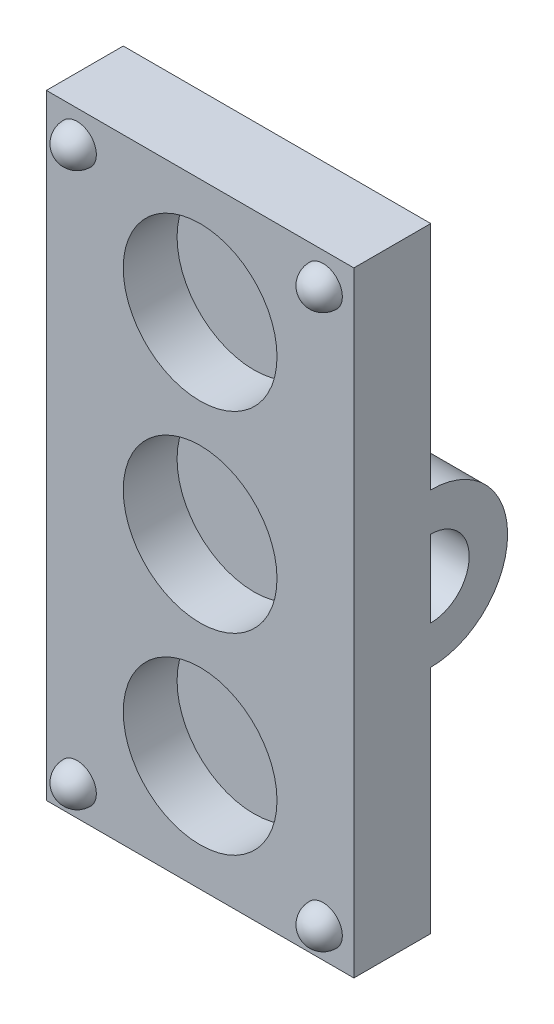
ISO-10303-21;
HEADER;
FILE_DESCRIPTION(('STEP AP214'),'2;1');
FILE_NAME('part.step','',(''),(''),'','','');
FILE_SCHEMA(('AUTOMOTIVE_DESIGN { 1 0 10303 214 1 1 1 1 }'));
ENDSEC;
DATA;
#1=APPLICATION_CONTEXT('core data for automotive mechanical design processes');
#2=APPLICATION_PROTOCOL_DEFINITION('international standard','automotive_design',2000,#1);
#3=PRODUCT_CONTEXT('',#1,'mechanical');
#4=PRODUCT('Part','Part','',(#3));
#5=PRODUCT_RELATED_PRODUCT_CATEGORY('part','',(#4));
#6=PRODUCT_DEFINITION_FORMATION('','',#4);
#7=PRODUCT_DEFINITION_CONTEXT('part definition',#1,'design');
#8=PRODUCT_DEFINITION('design','',#6,#7);
#9=PRODUCT_DEFINITION_SHAPE('','',#8);
#10=(LENGTH_UNIT() NAMED_UNIT(*) SI_UNIT(.MILLI.,.METRE.));
#11=(NAMED_UNIT(*) PLANE_ANGLE_UNIT() SI_UNIT($,.RADIAN.));
#12=(NAMED_UNIT(*) SI_UNIT($,.STERADIAN.) SOLID_ANGLE_UNIT());
#13=UNCERTAINTY_MEASURE_WITH_UNIT(LENGTH_MEASURE(1.E-05),#10,'distance_accuracy_value','');
#14=(GEOMETRIC_REPRESENTATION_CONTEXT(3) GLOBAL_UNCERTAINTY_ASSIGNED_CONTEXT((#13)) GLOBAL_UNIT_ASSIGNED_CONTEXT((#10,
#11,#12)) REPRESENTATION_CONTEXT('',''));
#15=CARTESIAN_POINT('',(0.,0.,0.));
#16=DIRECTION('',(0.,0.,1.));
#17=DIRECTION('',(1.,0.,0.));
#18=AXIS2_PLACEMENT_3D('',#15,#16,#17);
#19=CARTESIAN_POINT('',(0.,0.,0.));
#20=DIRECTION('',(0.,0.,1.));
#21=DIRECTION('',(1.,0.,0.));
#22=AXIS2_PLACEMENT_3D('',#19,#20,#21);
#23=PLANE('',#22);
#24=DIRECTION('',(0.,1.,0.));
#25=VECTOR('',#24,1.);
#26=CARTESIAN_POINT('',(20.,40.,0.));
#27=LINE('',#26,#25);
#28=CARTESIAN_POINT('',(20.,10.,0.));
#29=VERTEX_POINT('',#28);
#30=CARTESIAN_POINT('',(20.,40.,0.));
#31=VERTEX_POINT('',#30);
#32=EDGE_CURVE('E136',#29,#31,#27,.T.);
#33=ORIENTED_EDGE('',*,*,#32,.F.);
#34=DIRECTION('',(-1.,0.,0.));
#35=VECTOR('',#34,1.);
#36=CARTESIAN_POINT('',(20.,10.,0.));
#37=LINE('',#36,#35);
#38=CARTESIAN_POINT('',(-20.,10.,0.));
#39=VERTEX_POINT('',#38);
#40=EDGE_CURVE('E127',#29,#39,#37,.T.);
#41=ORIENTED_EDGE('',*,*,#40,.T.);
#42=DIRECTION('',(0.,-1.,0.));
#43=VECTOR('',#42,1.);
#44=CARTESIAN_POINT('',(-20.,40.,0.));
#45=LINE('',#44,#43);
#46=CARTESIAN_POINT('',(-20.,40.,0.));
#47=VERTEX_POINT('',#46);
#48=EDGE_CURVE('E168',#47,#39,#45,.T.);
#49=ORIENTED_EDGE('',*,*,#48,.F.);
#50=DIRECTION('',(-1.,0.,0.));
#51=VECTOR('',#50,1.);
#52=CARTESIAN_POINT('',(-20.,40.,0.));
#53=LINE('',#52,#51);
#54=EDGE_CURVE('E165',#31,#47,#53,.T.);
#55=ORIENTED_EDGE('',*,*,#54,.F.);
#56=EDGE_LOOP('',(#33,#41,#49,#55));
#57=FACE_BOUND('',#56,.T.);
#58=ADVANCED_FACE('F41',(#57),#23,.F.);
#59=CARTESIAN_POINT('',(20.,40.,10.));
#60=DIRECTION('',(-1.,0.,0.));
#61=DIRECTION('',(0.,-1.,0.));
#62=AXIS2_PLACEMENT_3D('',#59,#60,#61);
#63=PLANE('',#62);
#64=DIRECTION('',(0.,1.,0.));
#65=VECTOR('',#64,1.);
#66=CARTESIAN_POINT('',(20.,5.,0.));
#67=LINE('',#66,#65);
#68=CARTESIAN_POINT('',(20.,-5.,0.));
#69=VERTEX_POINT('',#68);
#70=CARTESIAN_POINT('',(20.,5.,0.));
#71=VERTEX_POINT('',#70);
#72=EDGE_CURVE('E109',#69,#71,#67,.T.);
#73=ORIENTED_EDGE('',*,*,#72,.T.);
#74=CARTESIAN_POINT('',(20.,0.,0.));
#75=DIRECTION('',(-1.,0.,0.));
#76=DIRECTION('',(0.,0.,1.));
#77=AXIS2_PLACEMENT_3D('',#74,#75,#76);
#78=CIRCLE('',#77,5.);
#79=EDGE_CURVE('E56',#71,#69,#78,.T.);
#80=ORIENTED_EDGE('',*,*,#79,.T.);
#81=EDGE_LOOP('',(#73,#80));
#82=FACE_BOUND('',#81,.T.);
#83=CARTESIAN_POINT('',(20.,-40.,0.));
#84=VERTEX_POINT('',#83);
#85=CARTESIAN_POINT('',(20.,-10.,0.));
#86=VERTEX_POINT('',#85);
#87=EDGE_CURVE('E162',#84,#86,#27,.T.);
#88=ORIENTED_EDGE('',*,*,#87,.T.);
#89=CARTESIAN_POINT('',(20.,0.,0.));
#90=DIRECTION('',(-1.,0.,0.));
#91=DIRECTION('',(0.,0.,1.));
#92=AXIS2_PLACEMENT_3D('',#89,#90,#91);
#93=CIRCLE('',#92,10.);
#94=EDGE_CURVE('E123',#29,#86,#93,.T.);
#95=ORIENTED_EDGE('',*,*,#94,.F.);
#96=ORIENTED_EDGE('',*,*,#32,.T.);
#97=DIRECTION('',(0.,0.,-1.));
#98=VECTOR('',#97,1.);
#99=CARTESIAN_POINT('',(20.,40.,10.));
#100=LINE('',#99,#98);
#101=CARTESIAN_POINT('',(20.,40.,10.));
#102=VERTEX_POINT('',#101);
#103=EDGE_CURVE('E180',#102,#31,#100,.T.);
#104=ORIENTED_EDGE('',*,*,#103,.F.);
#105=DIRECTION('',(0.,1.,0.));
#106=VECTOR('',#105,1.);
#107=CARTESIAN_POINT('',(20.,40.,10.));
#108=LINE('',#107,#106);
#109=CARTESIAN_POINT('',(20.,-40.,10.));
#110=VERTEX_POINT('',#109);
#111=EDGE_CURVE('E151',#110,#102,#108,.T.);
#112=ORIENTED_EDGE('',*,*,#111,.F.);
#113=DIRECTION('',(0.,0.,-1.));
#114=VECTOR('',#113,1.);
#115=CARTESIAN_POINT('',(20.,-40.,10.));
#116=LINE('',#115,#114);
#117=EDGE_CURVE('E161',#110,#84,#116,.T.);
#118=ORIENTED_EDGE('',*,*,#117,.T.);
#119=EDGE_LOOP('',(#88,#95,#96,#104,#112,#118));
#120=FACE_BOUND('',#119,.T.);
#121=ADVANCED_FACE('F43',(#82,#120),#63,.F.);
#122=CARTESIAN_POINT('',(-20.,40.,10.));
#123=DIRECTION('',(0.,-1.,0.));
#124=DIRECTION('',(0.,0.,-1.));
#125=AXIS2_PLACEMENT_3D('',#122,#123,#124);
#126=PLANE('',#125);
#127=ORIENTED_EDGE('',*,*,#54,.T.);
#128=DIRECTION('',(0.,0.,-1.));
#129=VECTOR('',#128,1.);
#130=CARTESIAN_POINT('',(-20.,40.,10.));
#131=LINE('',#130,#129);
#132=CARTESIAN_POINT('',(-20.,40.,10.));
#133=VERTEX_POINT('',#132);
#134=EDGE_CURVE('E177',#133,#47,#131,.T.);
#135=ORIENTED_EDGE('',*,*,#134,.F.);
#136=DIRECTION('',(-1.,0.,0.));
#137=VECTOR('',#136,1.);
#138=CARTESIAN_POINT('',(-20.,40.,10.));
#139=LINE('',#138,#137);
#140=EDGE_CURVE('E154',#102,#133,#139,.T.);
#141=ORIENTED_EDGE('',*,*,#140,.F.);
#142=ORIENTED_EDGE('',*,*,#103,.T.);
#143=EDGE_LOOP('',(#127,#135,#141,#142));
#144=FACE_BOUND('',#143,.T.);
#145=ADVANCED_FACE('F219',(#144),#126,.F.);
#146=CARTESIAN_POINT('',(-20.,40.,10.));
#147=DIRECTION('',(1.,0.,0.));
#148=DIRECTION('',(0.,0.,-1.));
#149=AXIS2_PLACEMENT_3D('',#146,#147,#148);
#150=PLANE('',#149);
#151=DIRECTION('',(0.,1.,0.));
#152=VECTOR('',#151,1.);
#153=CARTESIAN_POINT('',(-20.,5.,0.));
#154=LINE('',#153,#152);
#155=CARTESIAN_POINT('',(-20.,-5.,0.));
#156=VERTEX_POINT('',#155);
#157=CARTESIAN_POINT('',(-20.,5.,0.));
#158=VERTEX_POINT('',#157);
#159=EDGE_CURVE('E116',#156,#158,#154,.T.);
#160=ORIENTED_EDGE('',*,*,#159,.F.);
#161=CARTESIAN_POINT('',(-20.,0.,0.));
#162=DIRECTION('',(-1.,0.,0.));
#163=DIRECTION('',(0.,0.,1.));
#164=AXIS2_PLACEMENT_3D('',#161,#162,#163);
#165=CIRCLE('',#164,5.);
#166=EDGE_CURVE('E61',#158,#156,#165,.T.);
#167=ORIENTED_EDGE('',*,*,#166,.F.);
#168=EDGE_LOOP('',(#160,#167));
#169=FACE_BOUND('',#168,.T.);
#170=ORIENTED_EDGE('',*,*,#48,.T.);
#171=CARTESIAN_POINT('',(-20.,0.,0.));
#172=DIRECTION('',(-1.,0.,0.));
#173=DIRECTION('',(0.,0.,1.));
#174=AXIS2_PLACEMENT_3D('',#171,#172,#173);
#175=CIRCLE('',#174,10.);
#176=CARTESIAN_POINT('',(-20.,-10.,0.));
#177=VERTEX_POINT('',#176);
#178=EDGE_CURVE('E121',#39,#177,#175,.T.);
#179=ORIENTED_EDGE('',*,*,#178,.T.);
#180=CARTESIAN_POINT('',(-20.,-40.,0.));
#181=VERTEX_POINT('',#180);
#182=EDGE_CURVE('E167',#177,#181,#45,.T.);
#183=ORIENTED_EDGE('',*,*,#182,.T.);
#184=DIRECTION('',(0.,0.,-1.));
#185=VECTOR('',#184,1.);
#186=CARTESIAN_POINT('',(-20.,-40.,10.));
#187=LINE('',#186,#185);
#188=CARTESIAN_POINT('',(-20.,-40.,10.));
#189=VERTEX_POINT('',#188);
#190=EDGE_CURVE('E174',#189,#181,#187,.T.);
#191=ORIENTED_EDGE('',*,*,#190,.F.);
#192=DIRECTION('',(0.,-1.,0.));
#193=VECTOR('',#192,1.);
#194=CARTESIAN_POINT('',(-20.,40.,10.));
#195=LINE('',#194,#193);
#196=EDGE_CURVE('E157',#133,#189,#195,.T.);
#197=ORIENTED_EDGE('',*,*,#196,.F.);
#198=ORIENTED_EDGE('',*,*,#134,.T.);
#199=EDGE_LOOP('',(#170,#179,#183,#191,#197,#198));
#200=FACE_BOUND('',#199,.T.);
#201=ADVANCED_FACE('F224',(#169,#200),#150,.F.);
#202=CARTESIAN_POINT('',(-20.,-40.,10.));
#203=DIRECTION('',(0.,1.,0.));
#204=DIRECTION('',(0.,0.,1.));
#205=AXIS2_PLACEMENT_3D('',#202,#203,#204);
#206=PLANE('',#205);
#207=DIRECTION('',(1.,0.,0.));
#208=VECTOR('',#207,1.);
#209=CARTESIAN_POINT('',(-20.,-40.,0.));
#210=LINE('',#209,#208);
#211=EDGE_CURVE('E155',#181,#84,#210,.T.);
#212=ORIENTED_EDGE('',*,*,#211,.T.);
#213=ORIENTED_EDGE('',*,*,#117,.F.);
#214=DIRECTION('',(1.,0.,0.));
#215=VECTOR('',#214,1.);
#216=CARTESIAN_POINT('',(-20.,-40.,10.));
#217=LINE('',#216,#215);
#218=EDGE_CURVE('E159',#189,#110,#217,.T.);
#219=ORIENTED_EDGE('',*,*,#218,.F.);
#220=ORIENTED_EDGE('',*,*,#190,.T.);
#221=EDGE_LOOP('',(#212,#213,#219,#220));
#222=FACE_BOUND('',#221,.T.);
#223=ADVANCED_FACE('F197',(#222),#206,.F.);
#224=CARTESIAN_POINT('',(0.,0.,10.));
#225=DIRECTION('',(0.,0.,1.));
#226=DIRECTION('',(1.,0.,0.));
#227=AXIS2_PLACEMENT_3D('',#224,#225,#226);
#228=PLANE('',#227);
#229=CARTESIAN_POINT('',(16.,-36.,10.));
#230=DIRECTION('',(0.,0.,1.));
#231=DIRECTION('',(1.,0.,0.));
#232=AXIS2_PLACEMENT_3D('',#229,#230,#231);
#233=CIRCLE('',#232,2.5);
#234=CARTESIAN_POINT('',(18.5,-36.,10.));
#235=VERTEX_POINT('',#234);
#236=EDGE_CURVE('E11',#235,#235,#233,.T.);
#237=ORIENTED_EDGE('',*,*,#236,.F.);
#238=EDGE_LOOP('',(#237));
#239=FACE_BOUND('',#238,.T.);
#240=CARTESIAN_POINT('',(-16.,-36.,10.));
#241=DIRECTION('',(0.,0.,1.));
#242=DIRECTION('',(1.,0.,0.));
#243=AXIS2_PLACEMENT_3D('',#240,#241,#242);
#244=CIRCLE('',#243,2.5);
#245=CARTESIAN_POINT('',(-13.5,-36.,10.));
#246=VERTEX_POINT('',#245);
#247=EDGE_CURVE('E49',#246,#246,#244,.T.);
#248=ORIENTED_EDGE('',*,*,#247,.F.);
#249=EDGE_LOOP('',(#248));
#250=FACE_BOUND('',#249,.T.);
#251=CARTESIAN_POINT('',(-16.,36.,10.));
#252=DIRECTION('',(0.,0.,1.));
#253=DIRECTION('',(1.,0.,0.));
#254=AXIS2_PLACEMENT_3D('',#251,#252,#253);
#255=CIRCLE('',#254,2.5);
#256=CARTESIAN_POINT('',(-13.5,36.,10.));
#257=VERTEX_POINT('',#256);
#258=EDGE_CURVE('E186',#257,#257,#255,.T.);
#259=ORIENTED_EDGE('',*,*,#258,.F.);
#260=EDGE_LOOP('',(#259));
#261=FACE_BOUND('',#260,.T.);
#262=CARTESIAN_POINT('',(16.,36.,10.));
#263=DIRECTION('',(0.,0.,1.));
#264=DIRECTION('',(1.,0.,0.));
#265=AXIS2_PLACEMENT_3D('',#262,#263,#264);
#266=CIRCLE('',#265,2.5);
#267=CARTESIAN_POINT('',(18.5,36.,10.));
#268=VERTEX_POINT('',#267);
#269=EDGE_CURVE('E183',#268,#268,#266,.T.);
#270=ORIENTED_EDGE('',*,*,#269,.F.);
#271=EDGE_LOOP('',(#270));
#272=FACE_BOUND('',#271,.T.);
#273=CARTESIAN_POINT('',(0.,25.,10.));
#274=DIRECTION('',(0.,0.,1.));
#275=DIRECTION('',(1.,0.,0.));
#276=AXIS2_PLACEMENT_3D('',#273,#274,#275);
#277=CIRCLE('',#276,10.);
#278=CARTESIAN_POINT('',(10.,25.,10.));
#279=VERTEX_POINT('',#278);
#280=EDGE_CURVE('E137',#279,#279,#277,.T.);
#281=ORIENTED_EDGE('',*,*,#280,.F.);
#282=EDGE_LOOP('',(#281));
#283=FACE_BOUND('',#282,.T.);
#284=CARTESIAN_POINT('',(0.,0.,10.));
#285=DIRECTION('',(0.,0.,1.));
#286=DIRECTION('',(1.,0.,0.));
#287=AXIS2_PLACEMENT_3D('',#284,#285,#286);
#288=CIRCLE('',#287,10.);
#289=CARTESIAN_POINT('',(10.,0.,10.));
#290=VERTEX_POINT('',#289);
#291=EDGE_CURVE('E143',#290,#290,#288,.T.);
#292=ORIENTED_EDGE('',*,*,#291,.F.);
#293=EDGE_LOOP('',(#292));
#294=FACE_BOUND('',#293,.T.);
#295=CARTESIAN_POINT('',(0.,-25.,10.));
#296=DIRECTION('',(0.,0.,1.));
#297=DIRECTION('',(1.,0.,0.));
#298=AXIS2_PLACEMENT_3D('',#295,#296,#297);
#299=CIRCLE('',#298,10.);
#300=CARTESIAN_POINT('',(10.,-25.,10.));
#301=VERTEX_POINT('',#300);
#302=EDGE_CURVE('E130',#301,#301,#299,.T.);
#303=ORIENTED_EDGE('',*,*,#302,.F.);
#304=EDGE_LOOP('',(#303));
#305=FACE_BOUND('',#304,.T.);
#306=ORIENTED_EDGE('',*,*,#111,.T.);
#307=ORIENTED_EDGE('',*,*,#140,.T.);
#308=ORIENTED_EDGE('',*,*,#196,.T.);
#309=ORIENTED_EDGE('',*,*,#218,.T.);
#310=EDGE_LOOP('',(#306,#307,#308,#309));
#311=FACE_BOUND('',#310,.T.);
#312=ADVANCED_FACE('F193',(#239,#250,#261,#272,#283,#294,#305,#311),#228,.T.);
#313=ORIENTED_EDGE('',*,*,#182,.F.);
#314=DIRECTION('',(-1.,0.,0.));
#315=VECTOR('',#314,1.);
#316=CARTESIAN_POINT('',(20.,-10.,0.));
#317=LINE('',#316,#315);
#318=EDGE_CURVE('E125',#86,#177,#317,.T.);
#319=ORIENTED_EDGE('',*,*,#318,.F.);
#320=ORIENTED_EDGE('',*,*,#87,.F.);
#321=ORIENTED_EDGE('',*,*,#211,.F.);
#322=EDGE_LOOP('',(#313,#319,#320,#321));
#323=FACE_BOUND('',#322,.T.);
#324=ADVANCED_FACE('F196',(#323),#23,.F.);
#325=CARTESIAN_POINT('',(0.,-25.,3.));
#326=DIRECTION('',(0.,0.,1.));
#327=DIRECTION('',(1.,0.,0.));
#328=AXIS2_PLACEMENT_3D('',#325,#326,#327);
#329=CYLINDRICAL_SURFACE('',#328,10.);
#330=CARTESIAN_POINT('',(0.,-25.,3.));
#331=DIRECTION('',(0.,0.,1.));
#332=DIRECTION('',(1.,0.,0.));
#333=AXIS2_PLACEMENT_3D('',#330,#331,#332);
#334=CIRCLE('',#333,10.);
#335=CARTESIAN_POINT('',(10.,-25.,3.));
#336=VERTEX_POINT('',#335);
#337=EDGE_CURVE('E146',#336,#336,#334,.T.);
#338=CARTESIAN_POINT('',(10.,-25.,3.));
#339=CARTESIAN_POINT('',(10.,-25.,3.07291666666667));
#340=CARTESIAN_POINT('',(10.,-25.,3.14583333333333));
#341=CARTESIAN_POINT('',(10.,-25.,3.29166666666667));
#342=CARTESIAN_POINT('',(10.,-25.,3.36458333333333));
#343=CARTESIAN_POINT('',(10.,-25.,3.51041666666667));
#344=CARTESIAN_POINT('',(10.,-25.,3.58333333333333));
#345=CARTESIAN_POINT('',(10.,-25.,3.72916666666667));
#346=CARTESIAN_POINT('',(10.,-25.,3.80208333333333));
#347=CARTESIAN_POINT('',(10.,-25.,3.94791666666667));
#348=CARTESIAN_POINT('',(10.,-25.,4.02083333333333));
#349=CARTESIAN_POINT('',(10.,-25.,4.16666666666667));
#350=CARTESIAN_POINT('',(10.,-25.,4.23958333333333));
#351=CARTESIAN_POINT('',(10.,-25.,4.38541666666667));
#352=CARTESIAN_POINT('',(10.,-25.,4.45833333333333));
#353=CARTESIAN_POINT('',(10.,-25.,4.60416666666667));
#354=CARTESIAN_POINT('',(10.,-25.,4.67708333333333));
#355=CARTESIAN_POINT('',(10.,-25.,4.82291666666667));
#356=CARTESIAN_POINT('',(10.,-25.,4.89583333333333));
#357=CARTESIAN_POINT('',(10.,-25.,5.04166666666667));
#358=CARTESIAN_POINT('',(10.,-25.,5.11458333333333));
#359=CARTESIAN_POINT('',(10.,-25.,5.26041666666667));
#360=CARTESIAN_POINT('',(10.,-25.,5.33333333333333));
#361=CARTESIAN_POINT('',(10.,-25.,5.47916666666667));
#362=CARTESIAN_POINT('',(10.,-25.,5.55208333333333));
#363=CARTESIAN_POINT('',(10.,-25.,5.69791666666667));
#364=CARTESIAN_POINT('',(10.,-25.,5.77083333333333));
#365=CARTESIAN_POINT('',(10.,-25.,5.91666666666667));
#366=CARTESIAN_POINT('',(10.,-25.,5.98958333333333));
#367=CARTESIAN_POINT('',(10.,-25.,6.13541666666667));
#368=CARTESIAN_POINT('',(10.,-25.,6.20833333333333));
#369=CARTESIAN_POINT('',(10.,-25.,6.35416666666667));
#370=CARTESIAN_POINT('',(10.,-25.,6.42708333333333));
#371=CARTESIAN_POINT('',(10.,-25.,6.57291666666667));
#372=CARTESIAN_POINT('',(10.,-25.,6.64583333333333));
#373=CARTESIAN_POINT('',(10.,-25.,6.79166666666667));
#374=CARTESIAN_POINT('',(10.,-25.,6.86458333333333));
#375=CARTESIAN_POINT('',(10.,-25.,7.01041666666667));
#376=CARTESIAN_POINT('',(10.,-25.,7.08333333333333));
#377=CARTESIAN_POINT('',(10.,-25.,7.22916666666667));
#378=CARTESIAN_POINT('',(10.,-25.,7.30208333333333));
#379=CARTESIAN_POINT('',(10.,-25.,7.44791666666667));
#380=CARTESIAN_POINT('',(10.,-25.,7.52083333333333));
#381=CARTESIAN_POINT('',(10.,-25.,7.66666666666667));
#382=CARTESIAN_POINT('',(10.,-25.,7.73958333333333));
#383=CARTESIAN_POINT('',(10.,-25.,7.88541666666667));
#384=CARTESIAN_POINT('',(10.,-25.,7.95833333333333));
#385=CARTESIAN_POINT('',(10.,-25.,8.10416666666667));
#386=CARTESIAN_POINT('',(10.,-25.,8.17708333333333));
#387=CARTESIAN_POINT('',(10.,-25.,8.32291666666667));
#388=CARTESIAN_POINT('',(10.,-25.,8.39583333333333));
#389=CARTESIAN_POINT('',(10.,-25.,8.54166666666667));
#390=CARTESIAN_POINT('',(10.,-25.,8.61458333333333));
#391=CARTESIAN_POINT('',(10.,-25.,8.76041666666667));
#392=CARTESIAN_POINT('',(10.,-25.,8.83333333333333));
#393=CARTESIAN_POINT('',(10.,-25.,8.97916666666667));
#394=CARTESIAN_POINT('',(10.,-25.,9.05208333333333));
#395=CARTESIAN_POINT('',(10.,-25.,9.19791666666667));
#396=CARTESIAN_POINT('',(10.,-25.,9.27083333333333));
#397=CARTESIAN_POINT('',(10.,-25.,9.41666666666667));
#398=CARTESIAN_POINT('',(10.,-25.,9.48958333333333));
#399=CARTESIAN_POINT('',(10.,-25.,9.63541666666667));
#400=CARTESIAN_POINT('',(10.,-25.,9.70833333333333));
#401=CARTESIAN_POINT('',(10.,-25.,9.85416666666667));
#402=CARTESIAN_POINT('',(10.,-25.,9.92708333333333));
#403=CARTESIAN_POINT('',(10.,-25.,10.));
#404=B_SPLINE_CURVE_WITH_KNOTS('',3,(#338,#339,#340,#341,#342,#343,#344,#345,#346,#347,#348,
#349,#350,#351,#352,#353,#354,#355,#356,#357,#358,#359,#360,#361,#362,#363,#364,#365,#366,#367,
#368,#369,#370,#371,#372,#373,#374,#375,#376,#377,#378,#379,#380,#381,#382,#383,#384,#385,#386,
#387,#388,#389,#390,#391,#392,#393,#394,#395,#396,#397,#398,#399,#400,#401,#402,#403),
.UNSPECIFIED.,.F.,.F.,(4,2,2,2,2,2,2,2,2,2,2,2,2,2,2,2,2,2,2,2,2,2,2,2,2,2,2,2,2,2,2,2,4),(0.,
0.21875,0.4375,0.65625,0.875,1.09375,1.3125,1.53125,1.75,1.96875,2.1875,2.40625,2.625,2.84375,
3.0625,3.28125,3.5,3.71875,3.9375,4.15625,4.375,4.59375,4.8125,5.03125,5.25,5.46875,5.6875,
5.90625,6.125,6.34375,6.5625,6.78125,7.),.UNSPECIFIED.);
#405=EDGE_CURVE('BSEAM241',#336,#301,#404,.T.);
#406=ORIENTED_EDGE('',*,*,#337,.F.);
#407=ORIENTED_EDGE('',*,*,#302,.T.);
#408=ORIENTED_EDGE('',*,*,#405,.T.);
#409=ORIENTED_EDGE('',*,*,#405,.F.);
#410=EDGE_LOOP('',(#406,#408,#407,#409));
#411=FACE_BOUND('',#410,.T.);
#412=ADVANCED_FACE('F241',(#411),#329,.F.);
#413=CARTESIAN_POINT('',(0.,-25.,3.));
#414=DIRECTION('',(0.,0.,1.));
#415=DIRECTION('',(1.,0.,0.));
#416=AXIS2_PLACEMENT_3D('',#413,#414,#415);
#417=PLANE('',#416);
#418=ORIENTED_EDGE('',*,*,#337,.T.);
#419=EDGE_LOOP('',(#418));
#420=FACE_BOUND('',#419,.T.);
#421=ADVANCED_FACE('F245',(#420),#417,.T.);
#422=CARTESIAN_POINT('',(0.,0.,3.));
#423=DIRECTION('',(0.,0.,1.));
#424=DIRECTION('',(1.,0.,0.));
#425=AXIS2_PLACEMENT_3D('',#422,#423,#424);
#426=CYLINDRICAL_SURFACE('',#425,10.);
#427=CARTESIAN_POINT('',(0.,0.,3.));
#428=DIRECTION('',(0.,0.,1.));
#429=DIRECTION('',(1.,0.,0.));
#430=AXIS2_PLACEMENT_3D('',#427,#428,#429);
#431=CIRCLE('',#430,10.);
#432=CARTESIAN_POINT('',(10.,0.,3.));
#433=VERTEX_POINT('',#432);
#434=EDGE_CURVE('E140',#433,#433,#431,.T.);
#435=CARTESIAN_POINT('',(10.,0.,3.));
#436=CARTESIAN_POINT('',(10.,0.,3.07291666666667));
#437=CARTESIAN_POINT('',(10.,0.,3.14583333333333));
#438=CARTESIAN_POINT('',(10.,0.,3.29166666666667));
#439=CARTESIAN_POINT('',(10.,0.,3.36458333333333));
#440=CARTESIAN_POINT('',(10.,0.,3.51041666666667));
#441=CARTESIAN_POINT('',(10.,0.,3.58333333333333));
#442=CARTESIAN_POINT('',(10.,0.,3.72916666666667));
#443=CARTESIAN_POINT('',(10.,0.,3.80208333333333));
#444=CARTESIAN_POINT('',(10.,0.,3.94791666666667));
#445=CARTESIAN_POINT('',(10.,0.,4.02083333333333));
#446=CARTESIAN_POINT('',(10.,0.,4.16666666666667));
#447=CARTESIAN_POINT('',(10.,0.,4.23958333333333));
#448=CARTESIAN_POINT('',(10.,0.,4.38541666666667));
#449=CARTESIAN_POINT('',(10.,0.,4.45833333333333));
#450=CARTESIAN_POINT('',(10.,0.,4.60416666666667));
#451=CARTESIAN_POINT('',(10.,0.,4.67708333333333));
#452=CARTESIAN_POINT('',(10.,0.,4.82291666666667));
#453=CARTESIAN_POINT('',(10.,0.,4.89583333333333));
#454=CARTESIAN_POINT('',(10.,0.,5.04166666666667));
#455=CARTESIAN_POINT('',(10.,0.,5.11458333333333));
#456=CARTESIAN_POINT('',(10.,0.,5.26041666666667));
#457=CARTESIAN_POINT('',(10.,0.,5.33333333333333));
#458=CARTESIAN_POINT('',(10.,0.,5.47916666666667));
#459=CARTESIAN_POINT('',(10.,0.,5.55208333333333));
#460=CARTESIAN_POINT('',(10.,0.,5.69791666666667));
#461=CARTESIAN_POINT('',(10.,0.,5.77083333333333));
#462=CARTESIAN_POINT('',(10.,0.,5.91666666666667));
#463=CARTESIAN_POINT('',(10.,0.,5.98958333333333));
#464=CARTESIAN_POINT('',(10.,0.,6.13541666666667));
#465=CARTESIAN_POINT('',(10.,0.,6.20833333333333));
#466=CARTESIAN_POINT('',(10.,0.,6.35416666666667));
#467=CARTESIAN_POINT('',(10.,0.,6.42708333333333));
#468=CARTESIAN_POINT('',(10.,0.,6.57291666666667));
#469=CARTESIAN_POINT('',(10.,0.,6.64583333333333));
#470=CARTESIAN_POINT('',(10.,0.,6.79166666666667));
#471=CARTESIAN_POINT('',(10.,0.,6.86458333333333));
#472=CARTESIAN_POINT('',(10.,0.,7.01041666666667));
#473=CARTESIAN_POINT('',(10.,0.,7.08333333333333));
#474=CARTESIAN_POINT('',(10.,0.,7.22916666666667));
#475=CARTESIAN_POINT('',(10.,0.,7.30208333333333));
#476=CARTESIAN_POINT('',(10.,0.,7.44791666666667));
#477=CARTESIAN_POINT('',(10.,0.,7.52083333333333));
#478=CARTESIAN_POINT('',(10.,0.,7.66666666666667));
#479=CARTESIAN_POINT('',(10.,0.,7.73958333333333));
#480=CARTESIAN_POINT('',(10.,0.,7.88541666666667));
#481=CARTESIAN_POINT('',(10.,0.,7.95833333333333));
#482=CARTESIAN_POINT('',(10.,0.,8.10416666666667));
#483=CARTESIAN_POINT('',(10.,0.,8.17708333333333));
#484=CARTESIAN_POINT('',(10.,0.,8.32291666666667));
#485=CARTESIAN_POINT('',(10.,0.,8.39583333333333));
#486=CARTESIAN_POINT('',(10.,0.,8.54166666666667));
#487=CARTESIAN_POINT('',(10.,0.,8.61458333333333));
#488=CARTESIAN_POINT('',(10.,0.,8.76041666666667));
#489=CARTESIAN_POINT('',(10.,0.,8.83333333333333));
#490=CARTESIAN_POINT('',(10.,0.,8.97916666666667));
#491=CARTESIAN_POINT('',(10.,0.,9.05208333333333));
#492=CARTESIAN_POINT('',(10.,0.,9.19791666666667));
#493=CARTESIAN_POINT('',(10.,0.,9.27083333333333));
#494=CARTESIAN_POINT('',(10.,0.,9.41666666666667));
#495=CARTESIAN_POINT('',(10.,0.,9.48958333333333));
#496=CARTESIAN_POINT('',(10.,0.,9.63541666666667));
#497=CARTESIAN_POINT('',(10.,0.,9.70833333333333));
#498=CARTESIAN_POINT('',(10.,0.,9.85416666666667));
#499=CARTESIAN_POINT('',(10.,0.,9.92708333333333));
#500=CARTESIAN_POINT('',(10.,0.,10.));
#501=B_SPLINE_CURVE_WITH_KNOTS('',3,(#435,#436,#437,#438,#439,#440,#441,#442,#443,#444,#445,
#446,#447,#448,#449,#450,#451,#452,#453,#454,#455,#456,#457,#458,#459,#460,#461,#462,#463,#464,
#465,#466,#467,#468,#469,#470,#471,#472,#473,#474,#475,#476,#477,#478,#479,#480,#481,#482,#483,
#484,#485,#486,#487,#488,#489,#490,#491,#492,#493,#494,#495,#496,#497,#498,#499,#500),
.UNSPECIFIED.,.F.,.F.,(4,2,2,2,2,2,2,2,2,2,2,2,2,2,2,2,2,2,2,2,2,2,2,2,2,2,2,2,2,2,2,2,4),(0.,
0.21875,0.4375,0.65625,0.875,1.09375,1.3125,1.53125,1.75,1.96875,2.1875,2.40625,2.625,2.84375,
3.0625,3.28125,3.5,3.71875,3.9375,4.15625,4.375,4.59375,4.8125,5.03125,5.25,5.46875,5.6875,
5.90625,6.125,6.34375,6.5625,6.78125,7.),.UNSPECIFIED.);
#502=EDGE_CURVE('BSEAM251',#433,#290,#501,.T.);
#503=ORIENTED_EDGE('',*,*,#434,.F.);
#504=ORIENTED_EDGE('',*,*,#291,.T.);
#505=ORIENTED_EDGE('',*,*,#502,.T.);
#506=ORIENTED_EDGE('',*,*,#502,.F.);
#507=EDGE_LOOP('',(#503,#505,#504,#506));
#508=FACE_BOUND('',#507,.T.);
#509=ADVANCED_FACE('F251',(#508),#426,.F.);
#510=CARTESIAN_POINT('',(0.,0.,3.));
#511=DIRECTION('',(0.,0.,1.));
#512=DIRECTION('',(1.,0.,0.));
#513=AXIS2_PLACEMENT_3D('',#510,#511,#512);
#514=PLANE('',#513);
#515=ORIENTED_EDGE('',*,*,#434,.T.);
#516=EDGE_LOOP('',(#515));
#517=FACE_BOUND('',#516,.T.);
#518=ADVANCED_FACE('F259',(#517),#514,.T.);
#519=CARTESIAN_POINT('',(0.,25.,3.));
#520=DIRECTION('',(0.,0.,1.));
#521=DIRECTION('',(1.,0.,0.));
#522=AXIS2_PLACEMENT_3D('',#519,#520,#521);
#523=CYLINDRICAL_SURFACE('',#522,10.);
#524=CARTESIAN_POINT('',(0.,25.,3.));
#525=DIRECTION('',(0.,0.,1.));
#526=DIRECTION('',(1.,0.,0.));
#527=AXIS2_PLACEMENT_3D('',#524,#525,#526);
#528=CIRCLE('',#527,10.);
#529=CARTESIAN_POINT('',(10.,25.,3.));
#530=VERTEX_POINT('',#529);
#531=EDGE_CURVE('E133',#530,#530,#528,.T.);
#532=CARTESIAN_POINT('',(10.,25.,3.));
#533=CARTESIAN_POINT('',(10.,25.,3.07291666666667));
#534=CARTESIAN_POINT('',(10.,25.,3.14583333333333));
#535=CARTESIAN_POINT('',(10.,25.,3.29166666666667));
#536=CARTESIAN_POINT('',(10.,25.,3.36458333333333));
#537=CARTESIAN_POINT('',(10.,25.,3.51041666666667));
#538=CARTESIAN_POINT('',(10.,25.,3.58333333333333));
#539=CARTESIAN_POINT('',(10.,25.,3.72916666666667));
#540=CARTESIAN_POINT('',(10.,25.,3.80208333333333));
#541=CARTESIAN_POINT('',(10.,25.,3.94791666666667));
#542=CARTESIAN_POINT('',(10.,25.,4.02083333333333));
#543=CARTESIAN_POINT('',(10.,25.,4.16666666666667));
#544=CARTESIAN_POINT('',(10.,25.,4.23958333333333));
#545=CARTESIAN_POINT('',(10.,25.,4.38541666666667));
#546=CARTESIAN_POINT('',(10.,25.,4.45833333333333));
#547=CARTESIAN_POINT('',(10.,25.,4.60416666666667));
#548=CARTESIAN_POINT('',(10.,25.,4.67708333333333));
#549=CARTESIAN_POINT('',(10.,25.,4.82291666666667));
#550=CARTESIAN_POINT('',(10.,25.,4.89583333333333));
#551=CARTESIAN_POINT('',(10.,25.,5.04166666666667));
#552=CARTESIAN_POINT('',(10.,25.,5.11458333333333));
#553=CARTESIAN_POINT('',(10.,25.,5.26041666666667));
#554=CARTESIAN_POINT('',(10.,25.,5.33333333333333));
#555=CARTESIAN_POINT('',(10.,25.,5.47916666666667));
#556=CARTESIAN_POINT('',(10.,25.,5.55208333333333));
#557=CARTESIAN_POINT('',(10.,25.,5.69791666666667));
#558=CARTESIAN_POINT('',(10.,25.,5.77083333333333));
#559=CARTESIAN_POINT('',(10.,25.,5.91666666666667));
#560=CARTESIAN_POINT('',(10.,25.,5.98958333333333));
#561=CARTESIAN_POINT('',(10.,25.,6.13541666666667));
#562=CARTESIAN_POINT('',(10.,25.,6.20833333333333));
#563=CARTESIAN_POINT('',(10.,25.,6.35416666666667));
#564=CARTESIAN_POINT('',(10.,25.,6.42708333333333));
#565=CARTESIAN_POINT('',(10.,25.,6.57291666666667));
#566=CARTESIAN_POINT('',(10.,25.,6.64583333333333));
#567=CARTESIAN_POINT('',(10.,25.,6.79166666666667));
#568=CARTESIAN_POINT('',(10.,25.,6.86458333333333));
#569=CARTESIAN_POINT('',(10.,25.,7.01041666666667));
#570=CARTESIAN_POINT('',(10.,25.,7.08333333333333));
#571=CARTESIAN_POINT('',(10.,25.,7.22916666666667));
#572=CARTESIAN_POINT('',(10.,25.,7.30208333333333));
#573=CARTESIAN_POINT('',(10.,25.,7.44791666666667));
#574=CARTESIAN_POINT('',(10.,25.,7.52083333333333));
#575=CARTESIAN_POINT('',(10.,25.,7.66666666666667));
#576=CARTESIAN_POINT('',(10.,25.,7.73958333333333));
#577=CARTESIAN_POINT('',(10.,25.,7.88541666666667));
#578=CARTESIAN_POINT('',(10.,25.,7.95833333333333));
#579=CARTESIAN_POINT('',(10.,25.,8.10416666666667));
#580=CARTESIAN_POINT('',(10.,25.,8.17708333333333));
#581=CARTESIAN_POINT('',(10.,25.,8.32291666666667));
#582=CARTESIAN_POINT('',(10.,25.,8.39583333333333));
#583=CARTESIAN_POINT('',(10.,25.,8.54166666666667));
#584=CARTESIAN_POINT('',(10.,25.,8.61458333333333));
#585=CARTESIAN_POINT('',(10.,25.,8.76041666666667));
#586=CARTESIAN_POINT('',(10.,25.,8.83333333333333));
#587=CARTESIAN_POINT('',(10.,25.,8.97916666666667));
#588=CARTESIAN_POINT('',(10.,25.,9.05208333333333));
#589=CARTESIAN_POINT('',(10.,25.,9.19791666666667));
#590=CARTESIAN_POINT('',(10.,25.,9.27083333333333));
#591=CARTESIAN_POINT('',(10.,25.,9.41666666666667));
#592=CARTESIAN_POINT('',(10.,25.,9.48958333333333));
#593=CARTESIAN_POINT('',(10.,25.,9.63541666666667));
#594=CARTESIAN_POINT('',(10.,25.,9.70833333333333));
#595=CARTESIAN_POINT('',(10.,25.,9.85416666666667));
#596=CARTESIAN_POINT('',(10.,25.,9.92708333333333));
#597=CARTESIAN_POINT('',(10.,25.,10.));
#598=B_SPLINE_CURVE_WITH_KNOTS('',3,(#532,#533,#534,#535,#536,#537,#538,#539,#540,#541,#542,
#543,#544,#545,#546,#547,#548,#549,#550,#551,#552,#553,#554,#555,#556,#557,#558,#559,#560,#561,
#562,#563,#564,#565,#566,#567,#568,#569,#570,#571,#572,#573,#574,#575,#576,#577,#578,#579,#580,
#581,#582,#583,#584,#585,#586,#587,#588,#589,#590,#591,#592,#593,#594,#595,#596,#597),
.UNSPECIFIED.,.F.,.F.,(4,2,2,2,2,2,2,2,2,2,2,2,2,2,2,2,2,2,2,2,2,2,2,2,2,2,2,2,2,2,2,2,4),(0.,
0.21875,0.4375,0.65625,0.875,1.09375,1.3125,1.53125,1.75,1.96875,2.1875,2.40625,2.625,2.84375,
3.0625,3.28125,3.5,3.71875,3.9375,4.15625,4.375,4.59375,4.8125,5.03125,5.25,5.46875,5.6875,
5.90625,6.125,6.34375,6.5625,6.78125,7.),.UNSPECIFIED.);
#599=EDGE_CURVE('BSEAM263',#530,#279,#598,.T.);
#600=ORIENTED_EDGE('',*,*,#531,.F.);
#601=ORIENTED_EDGE('',*,*,#280,.T.);
#602=ORIENTED_EDGE('',*,*,#599,.T.);
#603=ORIENTED_EDGE('',*,*,#599,.F.);
#604=EDGE_LOOP('',(#600,#602,#601,#603));
#605=FACE_BOUND('',#604,.T.);
#606=ADVANCED_FACE('F263',(#605),#523,.F.);
#607=CARTESIAN_POINT('',(0.,25.,3.));
#608=DIRECTION('',(0.,0.,1.));
#609=DIRECTION('',(1.,0.,0.));
#610=AXIS2_PLACEMENT_3D('',#607,#608,#609);
#611=PLANE('',#610);
#612=ORIENTED_EDGE('',*,*,#531,.T.);
#613=EDGE_LOOP('',(#612));
#614=FACE_BOUND('',#613,.T.);
#615=ADVANCED_FACE('F267',(#614),#611,.T.);
#616=CARTESIAN_POINT('',(16.,36.,10.));
#617=DIRECTION('',(0.,1.,0.));
#618=DIRECTION('',(1.,0.,0.));
#619=AXIS2_PLACEMENT_3D('',#616,#617,#618);
#620=SPHERICAL_SURFACE('',#619,2.5);
#621=CARTESIAN_POINT('',(16.,36.,10.));
#622=DIRECTION('',(0.,0.,1.));
#623=DIRECTION('',(1.,0.,0.));
#624=AXIS2_PLACEMENT_3D('',#621,#622,#623);
#625=SPHERICAL_SURFACE('',#624,2.5);
#626=ORIENTED_EDGE('',*,*,#269,.T.);
#627=EDGE_LOOP('',(#626));
#628=FACE_BOUND('',#627,.T.);
#629=ADVANCED_FACE('F271',(#628),#625,.T.);
#630=CARTESIAN_POINT('',(-16.,36.,10.));
#631=DIRECTION('',(0.,1.,0.));
#632=DIRECTION('',(1.,0.,0.));
#633=AXIS2_PLACEMENT_3D('',#630,#631,#632);
#634=SPHERICAL_SURFACE('',#633,2.5);
#635=CARTESIAN_POINT('',(-16.,36.,10.));
#636=DIRECTION('',(0.,0.,1.));
#637=DIRECTION('',(1.,0.,0.));
#638=AXIS2_PLACEMENT_3D('',#635,#636,#637);
#639=SPHERICAL_SURFACE('',#638,2.5);
#640=ORIENTED_EDGE('',*,*,#258,.T.);
#641=EDGE_LOOP('',(#640));
#642=FACE_BOUND('',#641,.T.);
#643=ADVANCED_FACE('F275',(#642),#639,.T.);
#644=CARTESIAN_POINT('',(-16.,-36.,10.));
#645=DIRECTION('',(0.,1.,0.));
#646=DIRECTION('',(1.,0.,0.));
#647=AXIS2_PLACEMENT_3D('',#644,#645,#646);
#648=SPHERICAL_SURFACE('',#647,2.5);
#649=CARTESIAN_POINT('',(-16.,-36.,10.));
#650=DIRECTION('',(0.,0.,1.));
#651=DIRECTION('',(1.,0.,0.));
#652=AXIS2_PLACEMENT_3D('',#649,#650,#651);
#653=SPHERICAL_SURFACE('',#652,2.5);
#654=ORIENTED_EDGE('',*,*,#247,.T.);
#655=EDGE_LOOP('',(#654));
#656=FACE_BOUND('',#655,.T.);
#657=ADVANCED_FACE('F191',(#656),#653,.T.);
#658=CARTESIAN_POINT('',(16.,-36.,10.));
#659=DIRECTION('',(0.,1.,0.));
#660=DIRECTION('',(-1.,0.,0.));
#661=AXIS2_PLACEMENT_3D('',#658,#659,#660);
#662=SPHERICAL_SURFACE('',#661,2.5);
#663=CARTESIAN_POINT('',(16.,-36.,10.));
#664=DIRECTION('',(0.,0.,1.));
#665=DIRECTION('',(1.,0.,0.));
#666=AXIS2_PLACEMENT_3D('',#663,#664,#665);
#667=SPHERICAL_SURFACE('',#666,2.5);
#668=ORIENTED_EDGE('',*,*,#236,.T.);
#669=EDGE_LOOP('',(#668));
#670=FACE_BOUND('',#669,.T.);
#671=ADVANCED_FACE('F282',(#670),#667,.T.);
#672=CARTESIAN_POINT('',(20.,0.,0.));
#673=DIRECTION('',(-1.,0.,0.));
#674=DIRECTION('',(0.,0.,1.));
#675=AXIS2_PLACEMENT_3D('',#672,#673,#674);
#676=CYLINDRICAL_SURFACE('',#675,10.);
#677=ORIENTED_EDGE('',*,*,#178,.F.);
#678=ORIENTED_EDGE('',*,*,#40,.F.);
#679=ORIENTED_EDGE('',*,*,#94,.T.);
#680=ORIENTED_EDGE('',*,*,#318,.T.);
#681=EDGE_LOOP('',(#677,#678,#679,#680));
#682=FACE_BOUND('',#681,.T.);
#683=ADVANCED_FACE('F232',(#682),#676,.T.);
#684=CARTESIAN_POINT('',(20.,0.,0.));
#685=DIRECTION('',(-1.,0.,0.));
#686=DIRECTION('',(0.,0.,1.));
#687=AXIS2_PLACEMENT_3D('',#684,#685,#686);
#688=CYLINDRICAL_SURFACE('',#687,5.);
#689=ORIENTED_EDGE('',*,*,#166,.T.);
#690=DIRECTION('',(-1.,0.,0.));
#691=VECTOR('',#690,1.);
#692=CARTESIAN_POINT('',(20.,-5.,0.));
#693=LINE('',#692,#691);
#694=EDGE_CURVE('E102',#69,#156,#693,.T.);
#695=ORIENTED_EDGE('',*,*,#694,.F.);
#696=ORIENTED_EDGE('',*,*,#79,.F.);
#697=DIRECTION('',(-1.,0.,0.));
#698=VECTOR('',#697,1.);
#699=CARTESIAN_POINT('',(20.,5.,0.));
#700=LINE('',#699,#698);
#701=EDGE_CURVE('E108',#71,#158,#700,.T.);
#702=ORIENTED_EDGE('',*,*,#701,.T.);
#703=EDGE_LOOP('',(#689,#695,#696,#702));
#704=FACE_BOUND('',#703,.T.);
#705=ADVANCED_FACE('F104',(#704),#688,.F.);
#706=CARTESIAN_POINT('',(20.,5.,0.));
#707=DIRECTION('',(0.,0.,1.));
#708=DIRECTION('',(1.,0.,0.));
#709=AXIS2_PLACEMENT_3D('',#706,#707,#708);
#710=PLANE('',#709);
#711=ORIENTED_EDGE('',*,*,#159,.T.);
#712=ORIENTED_EDGE('',*,*,#701,.F.);
#713=ORIENTED_EDGE('',*,*,#72,.F.);
#714=ORIENTED_EDGE('',*,*,#694,.T.);
#715=EDGE_LOOP('',(#711,#712,#713,#714));
#716=FACE_BOUND('',#715,.T.);
#717=ADVANCED_FACE('F112',(#716),#710,.F.);
#718=CLOSED_SHELL('',(#58,#121,#145,#201,#223,#312,#324,#412,#421,#509,#518,#606,#615,#629,#643,
#657,#671,#683,#705,#717));
#719=MANIFOLD_SOLID_BREP('B2',#718);
#720=ADVANCED_BREP_SHAPE_REPRESENTATION('',(#18,#719),#14);
#721=SHAPE_DEFINITION_REPRESENTATION(#9,#720);
ENDSEC;
END-ISO-10303-21;
